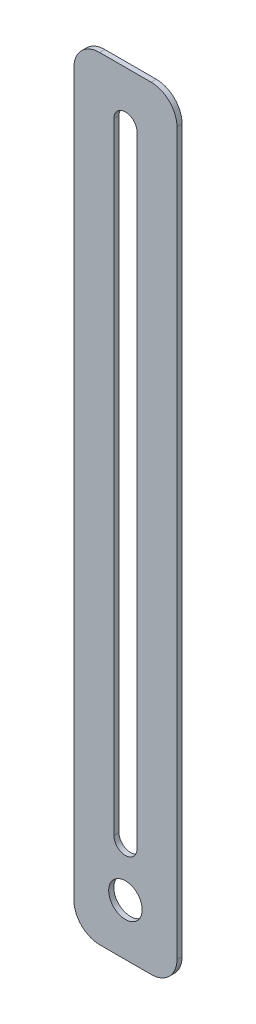
ISO-10303-21;
HEADER;
FILE_DESCRIPTION(('STEP AP214'),'2;1');
FILE_NAME('part.step','',(''),(''),'','','');
FILE_SCHEMA(('AUTOMOTIVE_DESIGN { 1 0 10303 214 1 1 1 1 }'));
ENDSEC;
DATA;
#1=APPLICATION_CONTEXT('core data for automotive mechanical design processes');
#2=APPLICATION_PROTOCOL_DEFINITION('international standard','automotive_design',2000,#1);
#3=PRODUCT_CONTEXT('',#1,'mechanical');
#4=PRODUCT('Part','Part','',(#3));
#5=PRODUCT_RELATED_PRODUCT_CATEGORY('part','',(#4));
#6=PRODUCT_DEFINITION_FORMATION('','',#4);
#7=PRODUCT_DEFINITION_CONTEXT('part definition',#1,'design');
#8=PRODUCT_DEFINITION('design','',#6,#7);
#9=PRODUCT_DEFINITION_SHAPE('','',#8);
#10=(LENGTH_UNIT() NAMED_UNIT(*) SI_UNIT(.MILLI.,.METRE.));
#11=(NAMED_UNIT(*) PLANE_ANGLE_UNIT() SI_UNIT($,.RADIAN.));
#12=(NAMED_UNIT(*) SI_UNIT($,.STERADIAN.) SOLID_ANGLE_UNIT());
#13=UNCERTAINTY_MEASURE_WITH_UNIT(LENGTH_MEASURE(1.E-05),#10,'distance_accuracy_value','');
#14=(GEOMETRIC_REPRESENTATION_CONTEXT(3) GLOBAL_UNCERTAINTY_ASSIGNED_CONTEXT((#13)) GLOBAL_UNIT_ASSIGNED_CONTEXT((#10,
#11,#12)) REPRESENTATION_CONTEXT('',''));
#15=CARTESIAN_POINT('',(0.,0.,0.));
#16=DIRECTION('',(0.,0.,1.));
#17=DIRECTION('',(1.,0.,0.));
#18=AXIS2_PLACEMENT_3D('',#15,#16,#17);
#19=CARTESIAN_POINT('',(-10.,-140.,2.));
#20=DIRECTION('',(0.,0.,-1.));
#21=DIRECTION('',(-1.,0.,0.));
#22=AXIS2_PLACEMENT_3D('',#19,#20,#21);
#23=PLANE('',#22);
#24=CARTESIAN_POINT('',(0.,-130.,2.));
#25=DIRECTION('',(0.,0.,1.));
#26=DIRECTION('',(1.,0.,0.));
#27=AXIS2_PLACEMENT_3D('',#24,#25,#26);
#28=CIRCLE('',#27,6.5);
#29=CARTESIAN_POINT('',(6.5,-130.,2.));
#30=VERTEX_POINT('',#29);
#31=EDGE_CURVE('E158',#30,#30,#28,.T.);
#32=ORIENTED_EDGE('',*,*,#31,.F.);
#33=EDGE_LOOP('',(#32));
#34=FACE_BOUND('',#33,.T.);
#35=CARTESIAN_POINT('',(-10.,-140.,2.));
#36=DIRECTION('',(0.,0.,1.));
#37=DIRECTION('',(-1.,0.,0.));
#38=AXIS2_PLACEMENT_3D('',#35,#36,#37);
#39=CIRCLE('',#38,10.);
#40=CARTESIAN_POINT('',(-20.,-140.,2.));
#41=VERTEX_POINT('',#40);
#42=CARTESIAN_POINT('',(-9.99999999999994,-150.,2.));
#43=VERTEX_POINT('',#42);
#44=EDGE_CURVE('E164',#41,#43,#39,.T.);
#45=ORIENTED_EDGE('',*,*,#44,.T.);
#46=DIRECTION('',(1.,0.,0.));
#47=VECTOR('',#46,1.);
#48=CARTESIAN_POINT('',(-9.99999999999994,-150.,2.));
#49=LINE('',#48,#47);
#50=CARTESIAN_POINT('',(9.99999999999992,-150.,2.));
#51=VERTEX_POINT('',#50);
#52=EDGE_CURVE('E167',#43,#51,#49,.T.);
#53=ORIENTED_EDGE('',*,*,#52,.T.);
#54=CARTESIAN_POINT('',(9.99999999999999,-140.,2.));
#55=DIRECTION('',(0.,0.,1.));
#56=DIRECTION('',(1.,0.,0.));
#57=AXIS2_PLACEMENT_3D('',#54,#55,#56);
#58=CIRCLE('',#57,10.);
#59=CARTESIAN_POINT('',(20.,-140.,2.));
#60=VERTEX_POINT('',#59);
#61=EDGE_CURVE('E170',#51,#60,#58,.T.);
#62=ORIENTED_EDGE('',*,*,#61,.T.);
#63=DIRECTION('',(0.,1.,0.));
#64=VECTOR('',#63,1.);
#65=CARTESIAN_POINT('',(20.,-140.,2.));
#66=LINE('',#65,#64);
#67=CARTESIAN_POINT('',(20.,140.,2.));
#68=VERTEX_POINT('',#67);
#69=EDGE_CURVE('E172',#60,#68,#66,.T.);
#70=ORIENTED_EDGE('',*,*,#69,.T.);
#71=CARTESIAN_POINT('',(9.99999999999999,140.,2.));
#72=DIRECTION('',(0.,0.,1.));
#73=DIRECTION('',(-1.,0.,0.));
#74=AXIS2_PLACEMENT_3D('',#71,#72,#73);
#75=CIRCLE('',#74,10.);
#76=CARTESIAN_POINT('',(9.99999999999992,150.,2.));
#77=VERTEX_POINT('',#76);
#78=EDGE_CURVE('E174',#68,#77,#75,.T.);
#79=ORIENTED_EDGE('',*,*,#78,.T.);
#80=DIRECTION('',(-1.,0.,0.));
#81=VECTOR('',#80,1.);
#82=CARTESIAN_POINT('',(-9.99999999999994,150.,2.));
#83=LINE('',#82,#81);
#84=CARTESIAN_POINT('',(-9.99999999999994,150.,2.));
#85=VERTEX_POINT('',#84);
#86=EDGE_CURVE('E176',#77,#85,#83,.T.);
#87=ORIENTED_EDGE('',*,*,#86,.T.);
#88=CARTESIAN_POINT('',(-10.,140.,2.));
#89=DIRECTION('',(0.,0.,1.));
#90=DIRECTION('',(-1.,0.,0.));
#91=AXIS2_PLACEMENT_3D('',#88,#89,#90);
#92=CIRCLE('',#91,10.);
#93=CARTESIAN_POINT('',(-20.,140.,2.));
#94=VERTEX_POINT('',#93);
#95=EDGE_CURVE('E178',#85,#94,#92,.T.);
#96=ORIENTED_EDGE('',*,*,#95,.T.);
#97=DIRECTION('',(0.,-1.,0.));
#98=VECTOR('',#97,1.);
#99=CARTESIAN_POINT('',(-20.,-140.,2.));
#100=LINE('',#99,#98);
#101=EDGE_CURVE('E180',#94,#41,#100,.T.);
#102=ORIENTED_EDGE('',*,*,#101,.T.);
#103=EDGE_LOOP('',(#45,#53,#62,#70,#79,#87,#96,#102));
#104=FACE_BOUND('',#103,.T.);
#105=CARTESIAN_POINT('',(0.,-110.5,2.));
#106=DIRECTION('',(0.,0.,1.));
#107=DIRECTION('',(1.,0.,0.));
#108=AXIS2_PLACEMENT_3D('',#105,#106,#107);
#109=CIRCLE('',#108,4.5);
#110=CARTESIAN_POINT('',(-4.5,-110.5,2.));
#111=VERTEX_POINT('',#110);
#112=CARTESIAN_POINT('',(4.5,-110.5,2.));
#113=VERTEX_POINT('',#112);
#114=EDGE_CURVE('E122',#111,#113,#109,.T.);
#115=ORIENTED_EDGE('',*,*,#114,.F.);
#116=DIRECTION('',(0.,-1.,0.));
#117=VECTOR('',#116,1.);
#118=CARTESIAN_POINT('',(-4.5,-110.5,2.));
#119=LINE('',#118,#117);
#120=CARTESIAN_POINT('',(-4.50000000000004,130.5,2.));
#121=VERTEX_POINT('',#120);
#122=EDGE_CURVE('E144',#121,#111,#119,.T.);
#123=ORIENTED_EDGE('',*,*,#122,.F.);
#124=CARTESIAN_POINT('',(0.,130.5,2.));
#125=DIRECTION('',(0.,0.,1.));
#126=DIRECTION('',(1.,0.,0.));
#127=AXIS2_PLACEMENT_3D('',#124,#125,#126);
#128=CIRCLE('',#127,4.5);
#129=CARTESIAN_POINT('',(4.49999999999996,130.5,2.));
#130=VERTEX_POINT('',#129);
#131=EDGE_CURVE('E142',#130,#121,#128,.T.);
#132=ORIENTED_EDGE('',*,*,#131,.F.);
#133=DIRECTION('',(0.,1.,0.));
#134=VECTOR('',#133,1.);
#135=CARTESIAN_POINT('',(4.5,-110.5,2.));
#136=LINE('',#135,#134);
#137=EDGE_CURVE('E130',#113,#130,#136,.T.);
#138=ORIENTED_EDGE('',*,*,#137,.F.);
#139=EDGE_LOOP('',(#115,#123,#132,#138));
#140=FACE_BOUND('',#139,.T.);
#141=ADVANCED_FACE('F33',(#34,#104,#140),#23,.F.);
#142=CARTESIAN_POINT('',(-10.,-140.,0.));
#143=DIRECTION('',(0.,0.,-1.));
#144=DIRECTION('',(-1.,0.,0.));
#145=AXIS2_PLACEMENT_3D('',#142,#143,#144);
#146=PLANE('',#145);
#147=CARTESIAN_POINT('',(-10.,-140.,0.));
#148=DIRECTION('',(0.,0.,1.));
#149=DIRECTION('',(-1.,0.,0.));
#150=AXIS2_PLACEMENT_3D('',#147,#148,#149);
#151=CIRCLE('',#150,10.);
#152=CARTESIAN_POINT('',(-20.,-140.,0.));
#153=VERTEX_POINT('',#152);
#154=CARTESIAN_POINT('',(-9.99999999999994,-150.,0.));
#155=VERTEX_POINT('',#154);
#156=EDGE_CURVE('E161',#153,#155,#151,.T.);
#157=ORIENTED_EDGE('',*,*,#156,.F.);
#158=DIRECTION('',(0.,-1.,0.));
#159=VECTOR('',#158,1.);
#160=CARTESIAN_POINT('',(-20.,-140.,0.));
#161=LINE('',#160,#159);
#162=CARTESIAN_POINT('',(-20.,140.,0.));
#163=VERTEX_POINT('',#162);
#164=EDGE_CURVE('E168',#163,#153,#161,.T.);
#165=ORIENTED_EDGE('',*,*,#164,.F.);
#166=CARTESIAN_POINT('',(-10.,140.,0.));
#167=DIRECTION('',(0.,0.,1.));
#168=DIRECTION('',(-1.,0.,0.));
#169=AXIS2_PLACEMENT_3D('',#166,#167,#168);
#170=CIRCLE('',#169,10.);
#171=CARTESIAN_POINT('',(-9.99999999999994,150.,0.));
#172=VERTEX_POINT('',#171);
#173=EDGE_CURVE('E195',#172,#163,#170,.T.);
#174=ORIENTED_EDGE('',*,*,#173,.F.);
#175=DIRECTION('',(-1.,0.,0.));
#176=VECTOR('',#175,1.);
#177=CARTESIAN_POINT('',(-9.99999999999994,150.,0.));
#178=LINE('',#177,#176);
#179=CARTESIAN_POINT('',(9.99999999999992,150.,0.));
#180=VERTEX_POINT('',#179);
#181=EDGE_CURVE('E193',#180,#172,#178,.T.);
#182=ORIENTED_EDGE('',*,*,#181,.F.);
#183=CARTESIAN_POINT('',(9.99999999999999,140.,0.));
#184=DIRECTION('',(0.,0.,1.));
#185=DIRECTION('',(-1.,0.,0.));
#186=AXIS2_PLACEMENT_3D('',#183,#184,#185);
#187=CIRCLE('',#186,10.);
#188=CARTESIAN_POINT('',(20.,140.,0.));
#189=VERTEX_POINT('',#188);
#190=EDGE_CURVE('E191',#189,#180,#187,.T.);
#191=ORIENTED_EDGE('',*,*,#190,.F.);
#192=DIRECTION('',(0.,1.,0.));
#193=VECTOR('',#192,1.);
#194=CARTESIAN_POINT('',(20.,-140.,0.));
#195=LINE('',#194,#193);
#196=CARTESIAN_POINT('',(20.,-140.,0.));
#197=VERTEX_POINT('',#196);
#198=EDGE_CURVE('E189',#197,#189,#195,.T.);
#199=ORIENTED_EDGE('',*,*,#198,.F.);
#200=CARTESIAN_POINT('',(9.99999999999999,-140.,0.));
#201=DIRECTION('',(0.,0.,1.));
#202=DIRECTION('',(1.,0.,0.));
#203=AXIS2_PLACEMENT_3D('',#200,#201,#202);
#204=CIRCLE('',#203,10.);
#205=CARTESIAN_POINT('',(9.99999999999992,-150.,0.));
#206=VERTEX_POINT('',#205);
#207=EDGE_CURVE('E187',#206,#197,#204,.T.);
#208=ORIENTED_EDGE('',*,*,#207,.F.);
#209=DIRECTION('',(1.,0.,0.));
#210=VECTOR('',#209,1.);
#211=CARTESIAN_POINT('',(-9.99999999999994,-150.,0.));
#212=LINE('',#211,#210);
#213=EDGE_CURVE('E185',#155,#206,#212,.T.);
#214=ORIENTED_EDGE('',*,*,#213,.F.);
#215=EDGE_LOOP('',(#157,#165,#174,#182,#191,#199,#208,#214));
#216=FACE_BOUND('',#215,.T.);
#217=CARTESIAN_POINT('',(0.,-130.,0.));
#218=DIRECTION('',(0.,0.,1.));
#219=DIRECTION('',(1.,0.,0.));
#220=AXIS2_PLACEMENT_3D('',#217,#218,#219);
#221=CIRCLE('',#220,6.5);
#222=CARTESIAN_POINT('',(6.5,-130.,0.));
#223=VERTEX_POINT('',#222);
#224=EDGE_CURVE('E138',#223,#223,#221,.T.);
#225=ORIENTED_EDGE('',*,*,#224,.T.);
#226=EDGE_LOOP('',(#225));
#227=FACE_BOUND('',#226,.T.);
#228=DIRECTION('',(0.,-1.,0.));
#229=VECTOR('',#228,1.);
#230=CARTESIAN_POINT('',(-4.5,-110.5,0.));
#231=LINE('',#230,#229);
#232=CARTESIAN_POINT('',(-4.50000000000004,130.5,0.));
#233=VERTEX_POINT('',#232);
#234=CARTESIAN_POINT('',(-4.5,-110.5,0.));
#235=VERTEX_POINT('',#234);
#236=EDGE_CURVE('E131',#233,#235,#231,.T.);
#237=ORIENTED_EDGE('',*,*,#236,.T.);
#238=CARTESIAN_POINT('',(0.,-110.5,0.));
#239=DIRECTION('',(0.,0.,1.));
#240=DIRECTION('',(1.,0.,0.));
#241=AXIS2_PLACEMENT_3D('',#238,#239,#240);
#242=CIRCLE('',#241,4.5);
#243=CARTESIAN_POINT('',(4.5,-110.5,0.));
#244=VERTEX_POINT('',#243);
#245=EDGE_CURVE('E56',#235,#244,#242,.T.);
#246=ORIENTED_EDGE('',*,*,#245,.T.);
#247=DIRECTION('',(0.,1.,0.));
#248=VECTOR('',#247,1.);
#249=CARTESIAN_POINT('',(4.5,-110.5,0.));
#250=LINE('',#249,#248);
#251=CARTESIAN_POINT('',(4.49999999999996,130.5,0.));
#252=VERTEX_POINT('',#251);
#253=EDGE_CURVE('E137',#244,#252,#250,.T.);
#254=ORIENTED_EDGE('',*,*,#253,.T.);
#255=CARTESIAN_POINT('',(0.,130.5,0.));
#256=DIRECTION('',(0.,0.,1.));
#257=DIRECTION('',(1.,0.,0.));
#258=AXIS2_PLACEMENT_3D('',#255,#256,#257);
#259=CIRCLE('',#258,4.5);
#260=EDGE_CURVE('E150',#252,#233,#259,.T.);
#261=ORIENTED_EDGE('',*,*,#260,.T.);
#262=EDGE_LOOP('',(#237,#246,#254,#261));
#263=FACE_BOUND('',#262,.T.);
#264=ADVANCED_FACE('F225',(#216,#227,#263),#146,.T.);
#265=CARTESIAN_POINT('',(-10.,-140.,2.));
#266=DIRECTION('',(0.,0.,-1.));
#267=DIRECTION('',(-1.,0.,0.));
#268=AXIS2_PLACEMENT_3D('',#265,#266,#267);
#269=CYLINDRICAL_SURFACE('',#268,10.);
#270=ORIENTED_EDGE('',*,*,#156,.T.);
#271=DIRECTION('',(0.,0.,-1.));
#272=VECTOR('',#271,1.);
#273=CARTESIAN_POINT('',(-9.99999999999994,-150.,2.));
#274=LINE('',#273,#272);
#275=EDGE_CURVE('E11',#43,#155,#274,.T.);
#276=ORIENTED_EDGE('',*,*,#275,.F.);
#277=ORIENTED_EDGE('',*,*,#44,.F.);
#278=DIRECTION('',(0.,0.,-1.));
#279=VECTOR('',#278,1.);
#280=CARTESIAN_POINT('',(-20.,-140.,2.));
#281=LINE('',#280,#279);
#282=EDGE_CURVE('E182',#41,#153,#281,.T.);
#283=ORIENTED_EDGE('',*,*,#282,.T.);
#284=EDGE_LOOP('',(#270,#276,#277,#283));
#285=FACE_BOUND('',#284,.T.);
#286=ADVANCED_FACE('F35',(#285),#269,.T.);
#287=CARTESIAN_POINT('',(-9.99999999999994,-150.,2.));
#288=DIRECTION('',(0.,1.,0.));
#289=DIRECTION('',(0.,0.,1.));
#290=AXIS2_PLACEMENT_3D('',#287,#288,#289);
#291=PLANE('',#290);
#292=ORIENTED_EDGE('',*,*,#213,.T.);
#293=DIRECTION('',(0.,0.,-1.));
#294=VECTOR('',#293,1.);
#295=CARTESIAN_POINT('',(9.99999999999992,-150.,2.));
#296=LINE('',#295,#294);
#297=EDGE_CURVE('E41',#51,#206,#296,.T.);
#298=ORIENTED_EDGE('',*,*,#297,.F.);
#299=ORIENTED_EDGE('',*,*,#52,.F.);
#300=ORIENTED_EDGE('',*,*,#275,.T.);
#301=EDGE_LOOP('',(#292,#298,#299,#300));
#302=FACE_BOUND('',#301,.T.);
#303=ADVANCED_FACE('F242',(#302),#291,.F.);
#304=CARTESIAN_POINT('',(9.99999999999999,-140.,2.));
#305=DIRECTION('',(0.,0.,-1.));
#306=DIRECTION('',(-1.,0.,0.));
#307=AXIS2_PLACEMENT_3D('',#304,#305,#306);
#308=CYLINDRICAL_SURFACE('',#307,10.);
#309=ORIENTED_EDGE('',*,*,#207,.T.);
#310=DIRECTION('',(0.,0.,-1.));
#311=VECTOR('',#310,1.);
#312=CARTESIAN_POINT('',(20.,-140.,2.));
#313=LINE('',#312,#311);
#314=EDGE_CURVE('E212',#60,#197,#313,.T.);
#315=ORIENTED_EDGE('',*,*,#314,.F.);
#316=ORIENTED_EDGE('',*,*,#61,.F.);
#317=ORIENTED_EDGE('',*,*,#297,.T.);
#318=EDGE_LOOP('',(#309,#315,#316,#317));
#319=FACE_BOUND('',#318,.T.);
#320=ADVANCED_FACE('F219',(#319),#308,.T.);
#321=CARTESIAN_POINT('',(20.,-140.,2.));
#322=DIRECTION('',(-1.,0.,0.));
#323=DIRECTION('',(0.,0.,1.));
#324=AXIS2_PLACEMENT_3D('',#321,#322,#323);
#325=PLANE('',#324);
#326=ORIENTED_EDGE('',*,*,#198,.T.);
#327=DIRECTION('',(0.,0.,-1.));
#328=VECTOR('',#327,1.);
#329=CARTESIAN_POINT('',(20.,140.,2.));
#330=LINE('',#329,#328);
#331=EDGE_CURVE('E209',#68,#189,#330,.T.);
#332=ORIENTED_EDGE('',*,*,#331,.F.);
#333=ORIENTED_EDGE('',*,*,#69,.F.);
#334=ORIENTED_EDGE('',*,*,#314,.T.);
#335=EDGE_LOOP('',(#326,#332,#333,#334));
#336=FACE_BOUND('',#335,.T.);
#337=ADVANCED_FACE('F231',(#336),#325,.F.);
#338=CARTESIAN_POINT('',(9.99999999999999,140.,2.));
#339=DIRECTION('',(0.,0.,-1.));
#340=DIRECTION('',(-1.,0.,0.));
#341=AXIS2_PLACEMENT_3D('',#338,#339,#340);
#342=CYLINDRICAL_SURFACE('',#341,10.);
#343=ORIENTED_EDGE('',*,*,#190,.T.);
#344=DIRECTION('',(0.,0.,-1.));
#345=VECTOR('',#344,1.);
#346=CARTESIAN_POINT('',(9.99999999999992,150.,2.));
#347=LINE('',#346,#345);
#348=EDGE_CURVE('E206',#77,#180,#347,.T.);
#349=ORIENTED_EDGE('',*,*,#348,.F.);
#350=ORIENTED_EDGE('',*,*,#78,.F.);
#351=ORIENTED_EDGE('',*,*,#331,.T.);
#352=EDGE_LOOP('',(#343,#349,#350,#351));
#353=FACE_BOUND('',#352,.T.);
#354=ADVANCED_FACE('F235',(#353),#342,.T.);
#355=CARTESIAN_POINT('',(-9.99999999999994,150.,2.));
#356=DIRECTION('',(0.,-1.,0.));
#357=DIRECTION('',(0.,0.,-1.));
#358=AXIS2_PLACEMENT_3D('',#355,#356,#357);
#359=PLANE('',#358);
#360=ORIENTED_EDGE('',*,*,#181,.T.);
#361=DIRECTION('',(0.,0.,-1.));
#362=VECTOR('',#361,1.);
#363=CARTESIAN_POINT('',(-9.99999999999994,150.,2.));
#364=LINE('',#363,#362);
#365=EDGE_CURVE('E203',#85,#172,#364,.T.);
#366=ORIENTED_EDGE('',*,*,#365,.F.);
#367=ORIENTED_EDGE('',*,*,#86,.F.);
#368=ORIENTED_EDGE('',*,*,#348,.T.);
#369=EDGE_LOOP('',(#360,#366,#367,#368));
#370=FACE_BOUND('',#369,.T.);
#371=ADVANCED_FACE('F255',(#370),#359,.F.);
#372=CARTESIAN_POINT('',(-10.,140.,2.));
#373=DIRECTION('',(0.,0.,-1.));
#374=DIRECTION('',(-1.,0.,0.));
#375=AXIS2_PLACEMENT_3D('',#372,#373,#374);
#376=CYLINDRICAL_SURFACE('',#375,10.);
#377=ORIENTED_EDGE('',*,*,#173,.T.);
#378=DIRECTION('',(0.,0.,-1.));
#379=VECTOR('',#378,1.);
#380=CARTESIAN_POINT('',(-20.,140.,2.));
#381=LINE('',#380,#379);
#382=EDGE_CURVE('E200',#94,#163,#381,.T.);
#383=ORIENTED_EDGE('',*,*,#382,.F.);
#384=ORIENTED_EDGE('',*,*,#95,.F.);
#385=ORIENTED_EDGE('',*,*,#365,.T.);
#386=EDGE_LOOP('',(#377,#383,#384,#385));
#387=FACE_BOUND('',#386,.T.);
#388=ADVANCED_FACE('F253',(#387),#376,.T.);
#389=CARTESIAN_POINT('',(-20.,-140.,2.));
#390=DIRECTION('',(1.,0.,0.));
#391=DIRECTION('',(0.,0.,-1.));
#392=AXIS2_PLACEMENT_3D('',#389,#390,#391);
#393=PLANE('',#392);
#394=ORIENTED_EDGE('',*,*,#164,.T.);
#395=ORIENTED_EDGE('',*,*,#282,.F.);
#396=ORIENTED_EDGE('',*,*,#101,.F.);
#397=ORIENTED_EDGE('',*,*,#382,.T.);
#398=EDGE_LOOP('',(#394,#395,#396,#397));
#399=FACE_BOUND('',#398,.T.);
#400=ADVANCED_FACE('F248',(#399),#393,.F.);
#401=CARTESIAN_POINT('',(0.,-130.,2.));
#402=DIRECTION('',(0.,0.,-1.));
#403=DIRECTION('',(-1.,0.,0.));
#404=AXIS2_PLACEMENT_3D('',#401,#402,#403);
#405=CYLINDRICAL_SURFACE('',#404,6.5);
#406=ORIENTED_EDGE('',*,*,#31,.T.);
#407=EDGE_LOOP('',(#406));
#408=FACE_BOUND('',#407,.T.);
#409=ORIENTED_EDGE('',*,*,#224,.F.);
#410=EDGE_LOOP('',(#409));
#411=FACE_BOUND('',#410,.T.);
#412=ADVANCED_FACE('F273',(#408,#411),#405,.F.);
#413=CARTESIAN_POINT('',(0.,-110.5,2.));
#414=DIRECTION('',(0.,0.,-1.));
#415=DIRECTION('',(-1.,0.,0.));
#416=AXIS2_PLACEMENT_3D('',#413,#414,#415);
#417=CYLINDRICAL_SURFACE('',#416,4.5);
#418=ORIENTED_EDGE('',*,*,#245,.F.);
#419=DIRECTION('',(0.,0.,-1.));
#420=VECTOR('',#419,1.);
#421=CARTESIAN_POINT('',(-4.5,-110.5,2.));
#422=LINE('',#421,#420);
#423=EDGE_CURVE('E126',#111,#235,#422,.T.);
#424=ORIENTED_EDGE('',*,*,#423,.F.);
#425=ORIENTED_EDGE('',*,*,#114,.T.);
#426=DIRECTION('',(0.,0.,-1.));
#427=VECTOR('',#426,1.);
#428=CARTESIAN_POINT('',(4.5,-110.5,2.));
#429=LINE('',#428,#427);
#430=EDGE_CURVE('E125',#113,#244,#429,.T.);
#431=ORIENTED_EDGE('',*,*,#430,.T.);
#432=EDGE_LOOP('',(#418,#424,#425,#431));
#433=FACE_BOUND('',#432,.T.);
#434=ADVANCED_FACE('F124',(#433),#417,.F.);
#435=CARTESIAN_POINT('',(4.5,-110.5,2.));
#436=DIRECTION('',(-1.,0.,0.));
#437=DIRECTION('',(0.,-1.,0.));
#438=AXIS2_PLACEMENT_3D('',#435,#436,#437);
#439=PLANE('',#438);
#440=ORIENTED_EDGE('',*,*,#253,.F.);
#441=ORIENTED_EDGE('',*,*,#430,.F.);
#442=ORIENTED_EDGE('',*,*,#137,.T.);
#443=DIRECTION('',(0.,0.,-1.));
#444=VECTOR('',#443,1.);
#445=CARTESIAN_POINT('',(4.49999999999996,130.5,2.));
#446=LINE('',#445,#444);
#447=EDGE_CURVE('E139',#130,#252,#446,.T.);
#448=ORIENTED_EDGE('',*,*,#447,.T.);
#449=EDGE_LOOP('',(#440,#441,#442,#448));
#450=FACE_BOUND('',#449,.T.);
#451=ADVANCED_FACE('F134',(#450),#439,.T.);
#452=CARTESIAN_POINT('',(0.,130.5,2.));
#453=DIRECTION('',(0.,0.,-1.));
#454=DIRECTION('',(-1.,0.,0.));
#455=AXIS2_PLACEMENT_3D('',#452,#453,#454);
#456=CYLINDRICAL_SURFACE('',#455,4.5);
#457=ORIENTED_EDGE('',*,*,#260,.F.);
#458=ORIENTED_EDGE('',*,*,#447,.F.);
#459=ORIENTED_EDGE('',*,*,#131,.T.);
#460=DIRECTION('',(0.,0.,-1.));
#461=VECTOR('',#460,1.);
#462=CARTESIAN_POINT('',(-4.50000000000004,130.5,2.));
#463=LINE('',#462,#461);
#464=EDGE_CURVE('E48',#121,#233,#463,.T.);
#465=ORIENTED_EDGE('',*,*,#464,.T.);
#466=EDGE_LOOP('',(#457,#458,#459,#465));
#467=FACE_BOUND('',#466,.T.);
#468=ADVANCED_FACE('F290',(#467),#456,.F.);
#469=CARTESIAN_POINT('',(-4.5,-110.5,2.));
#470=DIRECTION('',(1.,0.,0.));
#471=DIRECTION('',(0.,1.,0.));
#472=AXIS2_PLACEMENT_3D('',#469,#470,#471);
#473=PLANE('',#472);
#474=ORIENTED_EDGE('',*,*,#236,.F.);
#475=ORIENTED_EDGE('',*,*,#464,.F.);
#476=ORIENTED_EDGE('',*,*,#122,.T.);
#477=ORIENTED_EDGE('',*,*,#423,.T.);
#478=EDGE_LOOP('',(#474,#475,#476,#477));
#479=FACE_BOUND('',#478,.T.);
#480=ADVANCED_FACE('F288',(#479),#473,.T.);
#481=CLOSED_SHELL('',(#141,#264,#286,#303,#320,#337,#354,#371,#388,#400,#412,#434,#451,#468,#480));
#482=MANIFOLD_SOLID_BREP('B2',#481);
#483=ADVANCED_BREP_SHAPE_REPRESENTATION('',(#18,#482),#14);
#484=SHAPE_DEFINITION_REPRESENTATION(#9,#483);
ENDSEC;
END-ISO-10303-21;
